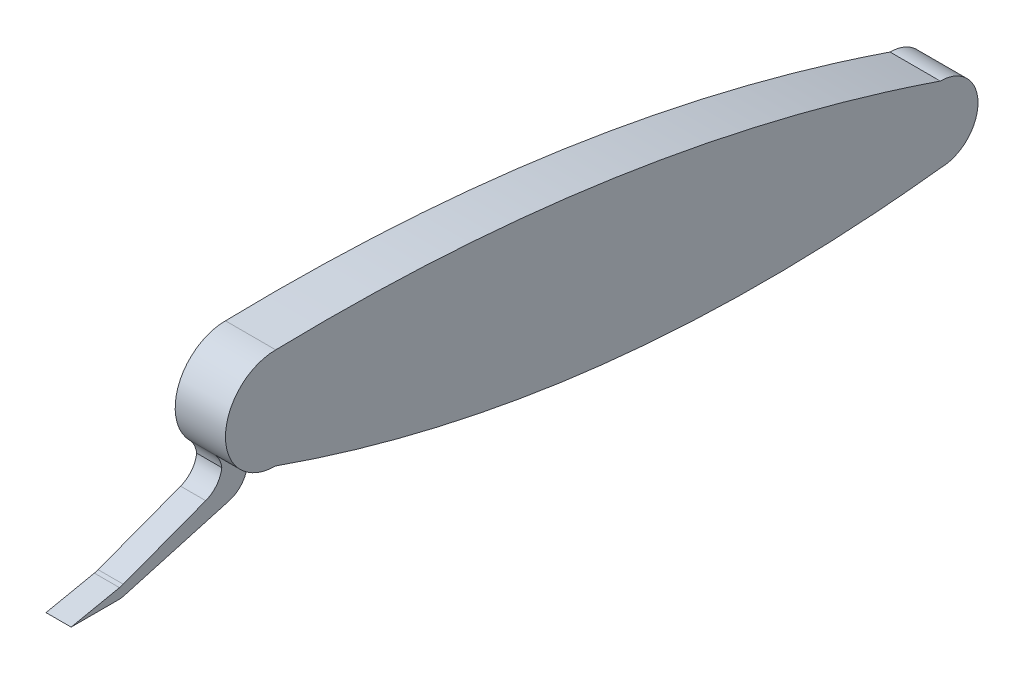
ISO-10303-21;
HEADER;
FILE_DESCRIPTION(('STEP AP214'),'2;1');
FILE_NAME('part.step','',(''),(''),'','','');
FILE_SCHEMA(('AUTOMOTIVE_DESIGN { 1 0 10303 214 1 1 1 1 }'));
ENDSEC;
DATA;
#1=APPLICATION_CONTEXT('core data for automotive mechanical design processes');
#2=APPLICATION_PROTOCOL_DEFINITION('international standard','automotive_design',2000,#1);
#3=PRODUCT_CONTEXT('',#1,'mechanical');
#4=PRODUCT('Part','Part','',(#3));
#5=PRODUCT_RELATED_PRODUCT_CATEGORY('part','',(#4));
#6=PRODUCT_DEFINITION_FORMATION('','',#4);
#7=PRODUCT_DEFINITION_CONTEXT('part definition',#1,'design');
#8=PRODUCT_DEFINITION('design','',#6,#7);
#9=PRODUCT_DEFINITION_SHAPE('','',#8);
#10=(LENGTH_UNIT() NAMED_UNIT(*) SI_UNIT(.MILLI.,.METRE.));
#11=(NAMED_UNIT(*) PLANE_ANGLE_UNIT() SI_UNIT($,.RADIAN.));
#12=(NAMED_UNIT(*) SI_UNIT($,.STERADIAN.) SOLID_ANGLE_UNIT());
#13=UNCERTAINTY_MEASURE_WITH_UNIT(LENGTH_MEASURE(1.E-05),#10,'distance_accuracy_value','');
#14=(GEOMETRIC_REPRESENTATION_CONTEXT(3) GLOBAL_UNCERTAINTY_ASSIGNED_CONTEXT((#13)) GLOBAL_UNIT_ASSIGNED_CONTEXT((#10,
#11,#12)) REPRESENTATION_CONTEXT('',''));
#15=CARTESIAN_POINT('',(0.,0.,0.));
#16=DIRECTION('',(0.,0.,1.));
#17=DIRECTION('',(1.,0.,0.));
#18=AXIS2_PLACEMENT_3D('',#15,#16,#17);
#19=CARTESIAN_POINT('',(20.,-15.4290868359324,-102.702838988307));
#20=DIRECTION('',(-1.,0.,0.));
#21=DIRECTION('',(0.,0.,1.));
#22=AXIS2_PLACEMENT_3D('',#19,#20,#21);
#23=PLANE('',#22);
#24=CARTESIAN_POINT('',(20.,70.,204.530172590958));
#25=CARTESIAN_POINT('',(20.,73.2413913882976,65.5595478654341));
#26=CARTESIAN_POINT('',(20.,30.4271590519452,-59.8197761746242));
#27=B_SPLINE_CURVE_WITH_KNOTS('',2,(#24,#25,#26),.UNSPECIFIED.,.F.,.F.,(3,3),(0.,
0.651255101531477),.UNSPECIFIED.);
#28=CARTESIAN_POINT('',(20.,70.,204.530172590958));
#29=VERTEX_POINT('',#28);
#30=CARTESIAN_POINT('',(20.,30.4271590519452,-59.8197761746242));
#31=VERTEX_POINT('',#30);
#32=EDGE_CURVE('E246',#29,#31,#27,.T.);
#33=ORIENTED_EDGE('',*,*,#32,.F.);
#34=CARTESIAN_POINT('',(20.,50.,204.530172590958));
#35=DIRECTION('',(1.,0.,0.));
#36=DIRECTION('',(0.,0.,-1.));
#37=AXIS2_PLACEMENT_3D('',#34,#35,#36);
#38=CIRCLE('',#37,20.);
#39=CARTESIAN_POINT('',(20.,30.,204.530172590958));
#40=VERTEX_POINT('',#39);
#41=EDGE_CURVE('E272',#29,#40,#38,.T.);
#42=ORIENTED_EDGE('',*,*,#41,.T.);
#43=CARTESIAN_POINT('',(20.,30.,204.530172590958));
#44=CARTESIAN_POINT('',(20.,-15.4206464424703,75.8072433384695));
#45=CARTESIAN_POINT('',(20.,0.427159051945149,-59.8197761746242));
#46=B_SPLINE_CURVE_WITH_KNOTS('',2,(#43,#44,#45),.UNSPECIFIED.,.F.,.F.,(3,3),(0.,1.),.UNSPECIFIED.);
#47=CARTESIAN_POINT('',(20.,0.427159051945149,-59.8197761746242));
#48=VERTEX_POINT('',#47);
#49=EDGE_CURVE('E270',#40,#48,#46,.T.);
#50=ORIENTED_EDGE('',*,*,#49,.T.);
#51=CARTESIAN_POINT('',(20.,15.4271590519451,-59.8197761746242));
#52=DIRECTION('',(1.,0.,0.));
#53=DIRECTION('',(0.,0.,-1.));
#54=AXIS2_PLACEMENT_3D('',#51,#52,#53);
#55=CIRCLE('',#54,15.);
#56=EDGE_CURVE('E265',#48,#31,#55,.T.);
#57=ORIENTED_EDGE('',*,*,#56,.T.);
#58=EDGE_LOOP('',(#33,#42,#50,#57));
#59=FACE_BOUND('',#58,.T.);
#60=ADVANCED_FACE('F41',(#59),#23,.F.);
#61=CARTESIAN_POINT('',(20.,50.,204.530172590958));
#62=DIRECTION('',(-1.,0.,0.));
#63=DIRECTION('',(0.,0.,1.));
#64=AXIS2_PLACEMENT_3D('',#61,#62,#63);
#65=CYLINDRICAL_SURFACE('',#64,20.);
#66=CARTESIAN_POINT('',(0.,50.,204.530172590958));
#67=DIRECTION('',(1.,0.,0.));
#68=DIRECTION('',(0.,0.,-1.));
#69=AXIS2_PLACEMENT_3D('',#66,#67,#68);
#70=CIRCLE('',#69,20.);
#71=CARTESIAN_POINT('',(0.,70.,204.530172590958));
#72=VERTEX_POINT('',#71);
#73=CARTESIAN_POINT('',(0.,35.9734336375444,218.786940670703));
#74=VERTEX_POINT('',#73);
#75=EDGE_CURVE('E248',#72,#74,#70,.T.);
#76=ORIENTED_EDGE('',*,*,#75,.T.);
#77=DIRECTION('',(-1.,0.,0.));
#78=VECTOR('',#77,1.);
#79=CARTESIAN_POINT('',(20.,35.9734336375444,218.786940670703));
#80=LINE('',#79,#78);
#81=CARTESIAN_POINT('',(10.,35.9734336375444,218.786940670703));
#82=VERTEX_POINT('',#81);
#83=EDGE_CURVE('E217',#74,#82,#80,.F.);
#84=ORIENTED_EDGE('',*,*,#83,.T.);
#85=CARTESIAN_POINT('',(10.,50.,204.530172590958));
#86=DIRECTION('',(1.,0.,0.));
#87=DIRECTION('',(0.,0.,-1.));
#88=AXIS2_PLACEMENT_3D('',#85,#86,#87);
#89=CIRCLE('',#88,20.);
#90=CARTESIAN_POINT('',(10.,30.,204.530172590958));
#91=VERTEX_POINT('',#90);
#92=EDGE_CURVE('E172',#82,#91,#89,.T.);
#93=ORIENTED_EDGE('',*,*,#92,.T.);
#94=DIRECTION('',(-1.,0.,0.));
#95=VECTOR('',#94,1.);
#96=CARTESIAN_POINT('',(20.,30.,204.530172590958));
#97=LINE('',#96,#95);
#98=EDGE_CURVE('E167',#40,#91,#97,.T.);
#99=ORIENTED_EDGE('',*,*,#98,.F.);
#100=ORIENTED_EDGE('',*,*,#41,.F.);
#101=DIRECTION('',(-1.,0.,0.));
#102=VECTOR('',#101,1.);
#103=CARTESIAN_POINT('',(20.,70.,204.530172590958));
#104=LINE('',#103,#102);
#105=EDGE_CURVE('E170',#29,#72,#104,.T.);
#106=ORIENTED_EDGE('',*,*,#105,.T.);
#107=EDGE_LOOP('',(#76,#84,#93,#99,#100,#106));
#108=FACE_BOUND('',#107,.T.);
#109=ADVANCED_FACE('F282',(#108),#65,.T.);
#110=DIRECTION('',(-1.,0.,0.));
#111=VECTOR('',#110,1.);
#112=SURFACE_OF_LINEAR_EXTRUSION('',#46,#111);
#113=DIRECTION('',(-1.,0.,0.));
#114=VECTOR('',#113,1.);
#115=CARTESIAN_POINT('',(20.,29.9910607641754,204.504836887293));
#116=LINE('',#115,#114);
#117=CARTESIAN_POINT('',(0.,29.9910607641754,204.504836887293));
#118=VERTEX_POINT('',#117);
#119=CARTESIAN_POINT('',(10.,29.9910607641754,204.504836887293));
#120=VERTEX_POINT('',#119);
#121=EDGE_CURVE('E165',#118,#120,#116,.F.);
#122=ORIENTED_EDGE('',*,*,#121,.F.);
#123=CARTESIAN_POINT('',(0.,30.,204.530172590958));
#124=CARTESIAN_POINT('',(0.,-15.4206464424703,75.8072433384695));
#125=CARTESIAN_POINT('',(0.,0.427159051945149,-59.8197761746242));
#126=B_SPLINE_CURVE_WITH_KNOTS('',2,(#123,#124,#125),.UNSPECIFIED.,.F.,.F.,(3,3),(0.,1.),.UNSPECIFIED.);
#127=CARTESIAN_POINT('',(0.,0.427159051945149,-59.8197761746242));
#128=VERTEX_POINT('',#127);
#129=EDGE_CURVE('E238',#118,#128,#126,.T.);
#130=ORIENTED_EDGE('',*,*,#129,.T.);
#131=DIRECTION('',(-1.,0.,0.));
#132=VECTOR('',#131,1.);
#133=CARTESIAN_POINT('',(20.,0.427159051945149,-59.8197761746242));
#134=LINE('',#133,#132);
#135=EDGE_CURVE('E460',#48,#128,#134,.T.);
#136=ORIENTED_EDGE('',*,*,#135,.F.);
#137=ORIENTED_EDGE('',*,*,#49,.F.);
#138=ORIENTED_EDGE('',*,*,#98,.T.);
#139=CARTESIAN_POINT('',(10.,30.,204.530172590958));
#140=CARTESIAN_POINT('',(10.,-15.4206464424703,75.8072433384695));
#141=CARTESIAN_POINT('',(10.,0.427159051945149,-59.8197761746242));
#142=B_SPLINE_CURVE_WITH_KNOTS('',2,(#139,#140,#141),.UNSPECIFIED.,.F.,.F.,(3,3),(0.,1.),.UNSPECIFIED.);
#143=EDGE_CURVE('E146',#91,#120,#142,.T.);
#144=ORIENTED_EDGE('',*,*,#143,.T.);
#145=EDGE_LOOP('',(#122,#130,#136,#137,#138,#144));
#146=FACE_BOUND('',#145,.T.);
#147=ADVANCED_FACE('F161',(#146),#112,.F.);
#148=DIRECTION('',(-1.,0.,0.));
#149=VECTOR('',#148,1.);
#150=SURFACE_OF_LINEAR_EXTRUSION('',#27,#149);
#151=CARTESIAN_POINT('',(0.,70.,204.530172590958));
#152=CARTESIAN_POINT('',(0.,73.2413913882976,65.5595478654341));
#153=CARTESIAN_POINT('',(0.,30.4271590519452,-59.8197761746242));
#154=B_SPLINE_CURVE_WITH_KNOTS('',2,(#151,#152,#153),.UNSPECIFIED.,.F.,.F.,(3,3),(0.,
0.651255101531477),.UNSPECIFIED.);
#155=CARTESIAN_POINT('',(0.,30.4271590519452,-59.8197761746242));
#156=VERTEX_POINT('',#155);
#157=EDGE_CURVE('E179',#72,#156,#154,.T.);
#158=ORIENTED_EDGE('',*,*,#157,.F.);
#159=ORIENTED_EDGE('',*,*,#105,.F.);
#160=ORIENTED_EDGE('',*,*,#32,.T.);
#161=DIRECTION('',(-1.,0.,0.));
#162=VECTOR('',#161,1.);
#163=CARTESIAN_POINT('',(20.,30.4271590519452,-59.8197761746242));
#164=LINE('',#163,#162);
#165=EDGE_CURVE('E268',#31,#156,#164,.T.);
#166=ORIENTED_EDGE('',*,*,#165,.T.);
#167=EDGE_LOOP('',(#158,#159,#160,#166));
#168=FACE_BOUND('',#167,.T.);
#169=ADVANCED_FACE('F281',(#168),#150,.T.);
#170=CARTESIAN_POINT('',(20.,15.4271590519451,-59.8197761746242));
#171=DIRECTION('',(-1.,0.,0.));
#172=DIRECTION('',(0.,0.,1.));
#173=AXIS2_PLACEMENT_3D('',#170,#171,#172);
#174=CYLINDRICAL_SURFACE('',#173,15.);
#175=CARTESIAN_POINT('',(0.,15.4271590519451,-59.8197761746242));
#176=DIRECTION('',(1.,0.,0.));
#177=DIRECTION('',(0.,0.,-1.));
#178=AXIS2_PLACEMENT_3D('',#175,#176,#177);
#179=CIRCLE('',#178,15.);
#180=EDGE_CURVE('E244',#128,#156,#179,.T.);
#181=ORIENTED_EDGE('',*,*,#180,.T.);
#182=ORIENTED_EDGE('',*,*,#165,.F.);
#183=ORIENTED_EDGE('',*,*,#56,.F.);
#184=ORIENTED_EDGE('',*,*,#135,.T.);
#185=EDGE_LOOP('',(#181,#182,#183,#184));
#186=FACE_BOUND('',#185,.T.);
#187=ADVANCED_FACE('F283',(#186),#174,.T.);
#188=CARTESIAN_POINT('',(0.,0.,0.));
#189=DIRECTION('',(1.,0.,0.));
#190=DIRECTION('',(0.,0.,-1.));
#191=AXIS2_PLACEMENT_3D('',#188,#189,#190);
#192=PLANE('',#191);
#193=CARTESIAN_POINT('',(0.,24.8704865223524,195.915324710576));
#194=DIRECTION('',(1.,0.,0.));
#195=DIRECTION('',(0.,0.,-1.));
#196=AXIS2_PLACEMENT_3D('',#193,#194,#195);
#197=CIRCLE('',#196,10.);
#198=CARTESIAN_POINT('',(0.,25.8789874395282,205.864341038839));
#199=VERTEX_POINT('',#198);
#200=EDGE_CURVE('E156',#118,#199,#197,.T.);
#201=ORIENTED_EDGE('',*,*,#200,.T.);
#202=CARTESIAN_POINT('',(0.,26.8874883567039,215.813357367103));
#203=DIRECTION('',(1.,0.,0.));
#204=DIRECTION('',(0.,0.,-1.));
#205=AXIS2_PLACEMENT_3D('',#202,#203,#204);
#206=CIRCLE('',#205,10.);
#207=CARTESIAN_POINT('',(0.,17.2637864890637,213.095939040312));
#208=VERTEX_POINT('',#207);
#209=EDGE_CURVE('E64',#199,#208,#206,.F.);
#210=ORIENTED_EDGE('',*,*,#209,.T.);
#211=DIRECTION('',(0.,-0.271741832679068,0.962370186764023));
#212=VECTOR('',#211,1.);
#213=CARTESIAN_POINT('',(0.,71.7170143049613,20.2505368199647));
#214=LINE('',#213,#212);
#215=CARTESIAN_POINT('',(0.,5.54929201763889,254.582669740423));
#216=VERTEX_POINT('',#215);
#217=EDGE_CURVE('E182',#208,#216,#214,.T.);
#218=ORIENTED_EDGE('',*,*,#217,.T.);
#219=CARTESIAN_POINT('',(0.,15.1729938852791,257.300088067214));
#220=DIRECTION('',(1.,0.,0.));
#221=DIRECTION('',(0.,0.,-1.));
#222=AXIS2_PLACEMENT_3D('',#219,#220,#221);
#223=CIRCLE('',#222,10.);
#224=CARTESIAN_POINT('',(0.,5.17299388527913,257.300088067214));
#225=VERTEX_POINT('',#224);
#226=EDGE_CURVE('E201',#216,#225,#223,.F.);
#227=ORIENTED_EDGE('',*,*,#226,.T.);
#228=DIRECTION('',(0.,0.,1.));
#229=VECTOR('',#228,1.);
#230=CARTESIAN_POINT('',(0.,5.17299388527916,0.));
#231=LINE('',#230,#229);
#232=CARTESIAN_POINT('',(0.,5.17299388527913,275.915324710576));
#233=VERTEX_POINT('',#232);
#234=EDGE_CURVE('E181',#225,#233,#231,.T.);
#235=ORIENTED_EDGE('',*,*,#234,.T.);
#236=DIRECTION('',(0.,0.202936259001334,-0.979191949917147));
#237=VECTOR('',#236,1.);
#238=CARTESIAN_POINT('',(0.,59.788067823168,12.3909993520457));
#239=LINE('',#238,#237);
#240=CARTESIAN_POINT('',(0.,9.15902869678047,256.682225516183));
#241=VERTEX_POINT('',#240);
#242=EDGE_CURVE('E186',#233,#241,#239,.T.);
#243=ORIENTED_EDGE('',*,*,#242,.T.);
#244=CARTESIAN_POINT('',(0.,18.9509481959519,258.711588106196));
#245=DIRECTION('',(1.,0.,0.));
#246=DIRECTION('',(0.,0.,-1.));
#247=AXIS2_PLACEMENT_3D('',#244,#245,#246);
#248=CIRCLE('',#247,10.);
#249=CARTESIAN_POINT('',(0.,9.59436372597068,255.182519240885));
#250=VERTEX_POINT('',#249);
#251=EDGE_CURVE('E222',#241,#250,#248,.T.);
#252=ORIENTED_EDGE('',*,*,#251,.T.);
#253=DIRECTION('',(0.,-0.352906886531086,0.935658446998121));
#254=VECTOR('',#253,1.);
#255=CARTESIAN_POINT('',(0.,92.6607970919828,34.949327406955));
#256=LINE('',#255,#254);
#257=CARTESIAN_POINT('',(0.,21.9642912801278,222.386255845265));
#258=VERTEX_POINT('',#257);
#259=EDGE_CURVE('E188',#258,#250,#256,.T.);
#260=ORIENTED_EDGE('',*,*,#259,.F.);
#261=CARTESIAN_POINT('',(0.,31.320875750109,225.915324710576));
#262=DIRECTION('',(1.,0.,0.));
#263=DIRECTION('',(0.,0.,-1.));
#264=AXIS2_PLACEMENT_3D('',#261,#262,#263);
#265=CIRCLE('',#264,10.);
#266=CARTESIAN_POINT('',(0.,30.1405131032128,215.985231859962));
#267=VERTEX_POINT('',#266);
#268=EDGE_CURVE('E223',#258,#267,#265,.T.);
#269=ORIENTED_EDGE('',*,*,#268,.T.);
#270=CARTESIAN_POINT('',(0.,28.9601504563166,225.915324710576));
#271=DIRECTION('',(1.,0.,0.));
#272=DIRECTION('',(0.,0.,-1.));
#273=AXIS2_PLACEMENT_3D('',#270,#271,#272);
#274=CIRCLE('',#273,10.);
#275=EDGE_CURVE('E228',#267,#74,#274,.T.);
#276=ORIENTED_EDGE('',*,*,#275,.T.);
#277=ORIENTED_EDGE('',*,*,#75,.F.);
#278=ORIENTED_EDGE('',*,*,#157,.T.);
#279=ORIENTED_EDGE('',*,*,#180,.F.);
#280=ORIENTED_EDGE('',*,*,#129,.F.);
#281=EDGE_LOOP('',(#201,#210,#218,#227,#235,#243,#252,#260,#269,#276,#277,#278,#279,#280));
#282=FACE_BOUND('',#281,.T.);
#283=ADVANCED_FACE('F236',(#282),#192,.F.);
#284=CARTESIAN_POINT('',(10.,0.,0.));
#285=DIRECTION('',(1.,0.,0.));
#286=DIRECTION('',(0.,0.,-1.));
#287=AXIS2_PLACEMENT_3D('',#284,#285,#286);
#288=PLANE('',#287);
#289=DIRECTION('',(0.,-0.271741832679068,0.962370186764023));
#290=VECTOR('',#289,1.);
#291=CARTESIAN_POINT('',(10.,71.7170143049613,20.2505368199647));
#292=LINE('',#291,#290);
#293=CARTESIAN_POINT('',(10.,17.2637864890637,213.095939040312));
#294=VERTEX_POINT('',#293);
#295=CARTESIAN_POINT('',(10.,5.54929201763889,254.582669740423));
#296=VERTEX_POINT('',#295);
#297=EDGE_CURVE('E175',#294,#296,#292,.T.);
#298=ORIENTED_EDGE('',*,*,#297,.F.);
#299=CARTESIAN_POINT('',(10.,26.8874883567039,215.813357367103));
#300=DIRECTION('',(1.,0.,0.));
#301=DIRECTION('',(0.,0.,-1.));
#302=AXIS2_PLACEMENT_3D('',#299,#300,#301);
#303=CIRCLE('',#302,10.);
#304=CARTESIAN_POINT('',(10.,25.8789874395282,205.864341038839));
#305=VERTEX_POINT('',#304);
#306=EDGE_CURVE('E11',#294,#305,#303,.T.);
#307=ORIENTED_EDGE('',*,*,#306,.T.);
#308=CARTESIAN_POINT('',(10.,24.8704865223524,195.915324710576));
#309=DIRECTION('',(1.,0.,0.));
#310=DIRECTION('',(0.,0.,-1.));
#311=AXIS2_PLACEMENT_3D('',#308,#309,#310);
#312=CIRCLE('',#311,10.);
#313=EDGE_CURVE('E144',#305,#120,#312,.F.);
#314=ORIENTED_EDGE('',*,*,#313,.T.);
#315=ORIENTED_EDGE('',*,*,#143,.F.);
#316=ORIENTED_EDGE('',*,*,#92,.F.);
#317=CARTESIAN_POINT('',(10.,28.9601504563166,225.915324710576));
#318=DIRECTION('',(1.,0.,0.));
#319=DIRECTION('',(0.,0.,-1.));
#320=AXIS2_PLACEMENT_3D('',#317,#318,#319);
#321=CIRCLE('',#320,10.);
#322=CARTESIAN_POINT('',(10.,30.1405131032128,215.985231859962));
#323=VERTEX_POINT('',#322);
#324=EDGE_CURVE('E233',#82,#323,#321,.F.);
#325=ORIENTED_EDGE('',*,*,#324,.T.);
#326=CARTESIAN_POINT('',(10.,31.320875750109,225.915324710576));
#327=DIRECTION('',(1.,0.,0.));
#328=DIRECTION('',(0.,0.,-1.));
#329=AXIS2_PLACEMENT_3D('',#326,#327,#328);
#330=CIRCLE('',#329,10.);
#331=CARTESIAN_POINT('',(10.,21.9642912801278,222.386255845265));
#332=VERTEX_POINT('',#331);
#333=EDGE_CURVE('E227',#323,#332,#330,.F.);
#334=ORIENTED_EDGE('',*,*,#333,.T.);
#335=DIRECTION('',(0.,-0.352906886531086,0.935658446998121));
#336=VECTOR('',#335,1.);
#337=CARTESIAN_POINT('',(10.,92.6607970919828,34.949327406955));
#338=LINE('',#337,#336);
#339=CARTESIAN_POINT('',(10.,9.59436372597068,255.182519240885));
#340=VERTEX_POINT('',#339);
#341=EDGE_CURVE('E184',#332,#340,#338,.T.);
#342=ORIENTED_EDGE('',*,*,#341,.T.);
#343=CARTESIAN_POINT('',(10.,18.9509481959519,258.711588106196));
#344=DIRECTION('',(1.,0.,0.));
#345=DIRECTION('',(0.,0.,-1.));
#346=AXIS2_PLACEMENT_3D('',#343,#344,#345);
#347=CIRCLE('',#346,10.);
#348=CARTESIAN_POINT('',(10.,9.15902869678047,256.682225516183));
#349=VERTEX_POINT('',#348);
#350=EDGE_CURVE('E224',#340,#349,#347,.F.);
#351=ORIENTED_EDGE('',*,*,#350,.T.);
#352=DIRECTION('',(0.,0.202936259001334,-0.979191949917147));
#353=VECTOR('',#352,1.);
#354=CARTESIAN_POINT('',(10.,59.788067823168,12.3909993520457));
#355=LINE('',#354,#353);
#356=CARTESIAN_POINT('',(10.,5.17299388527913,275.915324710576));
#357=VERTEX_POINT('',#356);
#358=EDGE_CURVE('E198',#357,#349,#355,.T.);
#359=ORIENTED_EDGE('',*,*,#358,.F.);
#360=DIRECTION('',(0.,0.,1.));
#361=VECTOR('',#360,1.);
#362=CARTESIAN_POINT('',(10.,5.17299388527916,0.));
#363=LINE('',#362,#361);
#364=CARTESIAN_POINT('',(10.,5.17299388527913,257.300088067214));
#365=VERTEX_POINT('',#364);
#366=EDGE_CURVE('E195',#365,#357,#363,.T.);
#367=ORIENTED_EDGE('',*,*,#366,.F.);
#368=CARTESIAN_POINT('',(10.,15.1729938852791,257.300088067214));
#369=DIRECTION('',(1.,0.,0.));
#370=DIRECTION('',(0.,0.,-1.));
#371=AXIS2_PLACEMENT_3D('',#368,#369,#370);
#372=CIRCLE('',#371,10.);
#373=EDGE_CURVE('E210',#365,#296,#372,.T.);
#374=ORIENTED_EDGE('',*,*,#373,.T.);
#375=EDGE_LOOP('',(#298,#307,#314,#315,#316,#325,#334,#342,#351,#359,#367,#374));
#376=FACE_BOUND('',#375,.T.);
#377=ADVANCED_FACE('F150',(#376),#288,.T.);
#378=CARTESIAN_POINT('',(10.,92.6607970919828,34.949327406955));
#379=DIRECTION('',(0.,-0.935658446998121,-0.352906886531086));
#380=DIRECTION('',(0.,0.352906886531086,-0.935658446998121));
#381=AXIS2_PLACEMENT_3D('',#378,#379,#380);
#382=PLANE('',#381);
#383=ORIENTED_EDGE('',*,*,#259,.T.);
#384=DIRECTION('',(-1.,0.,0.));
#385=VECTOR('',#384,1.);
#386=CARTESIAN_POINT('',(10.,9.59436372597072,255.182519240885));
#387=LINE('',#386,#385);
#388=EDGE_CURVE('E216',#250,#340,#387,.F.);
#389=ORIENTED_EDGE('',*,*,#388,.T.);
#390=ORIENTED_EDGE('',*,*,#341,.F.);
#391=DIRECTION('',(-1.,0.,0.));
#392=VECTOR('',#391,1.);
#393=CARTESIAN_POINT('',(0.,21.9642912801278,222.386255845265));
#394=LINE('',#393,#392);
#395=EDGE_CURVE('E213',#332,#258,#394,.T.);
#396=ORIENTED_EDGE('',*,*,#395,.T.);
#397=EDGE_LOOP('',(#383,#389,#390,#396));
#398=FACE_BOUND('',#397,.T.);
#399=ADVANCED_FACE('F286',(#398),#382,.F.);
#400=CARTESIAN_POINT('',(10.,59.788067823168,12.3909993520457));
#401=DIRECTION('',(0.,0.979191949917146,0.202936259001334));
#402=DIRECTION('',(0.,-0.202936259001334,0.979191949917146));
#403=AXIS2_PLACEMENT_3D('',#400,#401,#402);
#404=PLANE('',#403);
#405=ORIENTED_EDGE('',*,*,#358,.T.);
#406=DIRECTION('',(-1.,0.,0.));
#407=VECTOR('',#406,1.);
#408=CARTESIAN_POINT('',(10.,9.15902869678047,256.682225516183));
#409=LINE('',#408,#407);
#410=EDGE_CURVE('E209',#349,#241,#409,.T.);
#411=ORIENTED_EDGE('',*,*,#410,.T.);
#412=ORIENTED_EDGE('',*,*,#242,.F.);
#413=DIRECTION('',(-1.,0.,0.));
#414=VECTOR('',#413,1.);
#415=CARTESIAN_POINT('',(10.,5.17299388527913,275.915324710576));
#416=LINE('',#415,#414);
#417=EDGE_CURVE('E171',#357,#233,#416,.T.);
#418=ORIENTED_EDGE('',*,*,#417,.F.);
#419=EDGE_LOOP('',(#405,#411,#412,#418));
#420=FACE_BOUND('',#419,.T.);
#421=ADVANCED_FACE('F291',(#420),#404,.T.);
#422=CARTESIAN_POINT('',(10.,5.17299388527916,0.));
#423=DIRECTION('',(0.,-1.,0.));
#424=DIRECTION('',(0.,0.,-1.));
#425=AXIS2_PLACEMENT_3D('',#422,#423,#424);
#426=PLANE('',#425);
#427=ORIENTED_EDGE('',*,*,#234,.F.);
#428=DIRECTION('',(-1.,0.,0.));
#429=VECTOR('',#428,1.);
#430=CARTESIAN_POINT('',(10.,5.17299388527913,257.300088067214));
#431=LINE('',#430,#429);
#432=EDGE_CURVE('E202',#225,#365,#431,.F.);
#433=ORIENTED_EDGE('',*,*,#432,.T.);
#434=ORIENTED_EDGE('',*,*,#366,.T.);
#435=ORIENTED_EDGE('',*,*,#417,.T.);
#436=EDGE_LOOP('',(#427,#433,#434,#435));
#437=FACE_BOUND('',#436,.T.);
#438=ADVANCED_FACE('F297',(#437),#426,.T.);
#439=CARTESIAN_POINT('',(10.,71.7170143049613,20.2505368199647));
#440=DIRECTION('',(0.,-0.962370186764023,-0.271741832679068));
#441=DIRECTION('',(0.,0.271741832679068,-0.962370186764023));
#442=AXIS2_PLACEMENT_3D('',#439,#440,#441);
#443=PLANE('',#442);
#444=ORIENTED_EDGE('',*,*,#217,.F.);
#445=DIRECTION('',(1.,0.,0.));
#446=VECTOR('',#445,1.);
#447=CARTESIAN_POINT('',(10.,17.2637864890637,213.095939040312));
#448=LINE('',#447,#446);
#449=EDGE_CURVE('E47',#208,#294,#448,.T.);
#450=ORIENTED_EDGE('',*,*,#449,.T.);
#451=ORIENTED_EDGE('',*,*,#297,.T.);
#452=DIRECTION('',(-1.,0.,0.));
#453=VECTOR('',#452,1.);
#454=CARTESIAN_POINT('',(10.,5.54929201763889,254.582669740423));
#455=LINE('',#454,#453);
#456=EDGE_CURVE('E194',#296,#216,#455,.T.);
#457=ORIENTED_EDGE('',*,*,#456,.T.);
#458=EDGE_LOOP('',(#444,#450,#451,#457));
#459=FACE_BOUND('',#458,.T.);
#460=ADVANCED_FACE('F303',(#459),#443,.T.);
#461=CARTESIAN_POINT('',(10.,15.1729938852791,257.300088067214));
#462=DIRECTION('',(-1.,0.,0.));
#463=DIRECTION('',(0.,0.,1.));
#464=AXIS2_PLACEMENT_3D('',#461,#462,#463);
#465=CYLINDRICAL_SURFACE('',#464,10.);
#466=ORIENTED_EDGE('',*,*,#373,.F.);
#467=ORIENTED_EDGE('',*,*,#432,.F.);
#468=ORIENTED_EDGE('',*,*,#226,.F.);
#469=ORIENTED_EDGE('',*,*,#456,.F.);
#470=EDGE_LOOP('',(#466,#467,#468,#469));
#471=FACE_BOUND('',#470,.T.);
#472=ADVANCED_FACE('F301',(#471),#465,.T.);
#473=CARTESIAN_POINT('',(10.,18.9509481959519,258.711588106196));
#474=DIRECTION('',(-1.,0.,0.));
#475=DIRECTION('',(0.,0.,1.));
#476=AXIS2_PLACEMENT_3D('',#473,#474,#475);
#477=CYLINDRICAL_SURFACE('',#476,10.);
#478=ORIENTED_EDGE('',*,*,#350,.F.);
#479=ORIENTED_EDGE('',*,*,#388,.F.);
#480=ORIENTED_EDGE('',*,*,#251,.F.);
#481=ORIENTED_EDGE('',*,*,#410,.F.);
#482=EDGE_LOOP('',(#478,#479,#480,#481));
#483=FACE_BOUND('',#482,.T.);
#484=ADVANCED_FACE('F311',(#483),#477,.F.);
#485=CARTESIAN_POINT('',(20.,28.9601504563166,225.915324710576));
#486=DIRECTION('',(-1.,0.,0.));
#487=DIRECTION('',(0.,0.,1.));
#488=AXIS2_PLACEMENT_3D('',#485,#486,#487);
#489=CYLINDRICAL_SURFACE('',#488,10.);
#490=DIRECTION('',(-1.,0.,0.));
#491=VECTOR('',#490,1.);
#492=CARTESIAN_POINT('',(5.,30.1405131032128,215.985231859962));
#493=LINE('',#492,#491);
#494=EDGE_CURVE('E169',#323,#267,#493,.T.);
#495=ORIENTED_EDGE('',*,*,#494,.F.);
#496=ORIENTED_EDGE('',*,*,#324,.F.);
#497=ORIENTED_EDGE('',*,*,#83,.F.);
#498=ORIENTED_EDGE('',*,*,#275,.F.);
#499=EDGE_LOOP('',(#495,#496,#497,#498));
#500=FACE_BOUND('',#499,.T.);
#501=ADVANCED_FACE('F320',(#500),#489,.F.);
#502=CARTESIAN_POINT('',(10.,31.320875750109,225.915324710576));
#503=DIRECTION('',(1.,0.,0.));
#504=DIRECTION('',(0.,0.,-1.));
#505=AXIS2_PLACEMENT_3D('',#502,#503,#504);
#506=CYLINDRICAL_SURFACE('',#505,10.);
#507=ORIENTED_EDGE('',*,*,#333,.F.);
#508=ORIENTED_EDGE('',*,*,#494,.T.);
#509=ORIENTED_EDGE('',*,*,#268,.F.);
#510=ORIENTED_EDGE('',*,*,#395,.F.);
#511=EDGE_LOOP('',(#507,#508,#509,#510));
#512=FACE_BOUND('',#511,.T.);
#513=ADVANCED_FACE('F317',(#512),#506,.F.);
#514=CARTESIAN_POINT('',(5.,24.8704865223524,195.915324710576));
#515=DIRECTION('',(-1.,0.,0.));
#516=DIRECTION('',(0.,0.,1.));
#517=AXIS2_PLACEMENT_3D('',#514,#515,#516);
#518=CYLINDRICAL_SURFACE('',#517,10.);
#519=ORIENTED_EDGE('',*,*,#313,.F.);
#520=DIRECTION('',(-1.,0.,0.));
#521=VECTOR('',#520,1.);
#522=CARTESIAN_POINT('',(5.,25.8789874395282,205.864341038839));
#523=LINE('',#522,#521);
#524=EDGE_CURVE('E154',#305,#199,#523,.T.);
#525=ORIENTED_EDGE('',*,*,#524,.T.);
#526=ORIENTED_EDGE('',*,*,#200,.F.);
#527=ORIENTED_EDGE('',*,*,#121,.T.);
#528=EDGE_LOOP('',(#519,#525,#526,#527));
#529=FACE_BOUND('',#528,.T.);
#530=ADVANCED_FACE('F168',(#529),#518,.F.);
#531=CARTESIAN_POINT('',(5.,26.8874883567039,215.813357367103));
#532=DIRECTION('',(-1.,0.,0.));
#533=DIRECTION('',(0.,0.,1.));
#534=AXIS2_PLACEMENT_3D('',#531,#532,#533);
#535=CYLINDRICAL_SURFACE('',#534,10.);
#536=ORIENTED_EDGE('',*,*,#306,.F.);
#537=ORIENTED_EDGE('',*,*,#449,.F.);
#538=ORIENTED_EDGE('',*,*,#209,.F.);
#539=ORIENTED_EDGE('',*,*,#524,.F.);
#540=EDGE_LOOP('',(#536,#537,#538,#539));
#541=FACE_BOUND('',#540,.T.);
#542=ADVANCED_FACE('F43',(#541),#535,.T.);
#543=CLOSED_SHELL('',(#60,#109,#147,#169,#187,#283,#377,#399,#421,#438,#460,#472,#484,#501,#513,
#530,#542));
#544=MANIFOLD_SOLID_BREP('B2',#543);
#545=ADVANCED_BREP_SHAPE_REPRESENTATION('',(#18,#544),#14);
#546=SHAPE_DEFINITION_REPRESENTATION(#9,#545);
ENDSEC;
END-ISO-10303-21;
